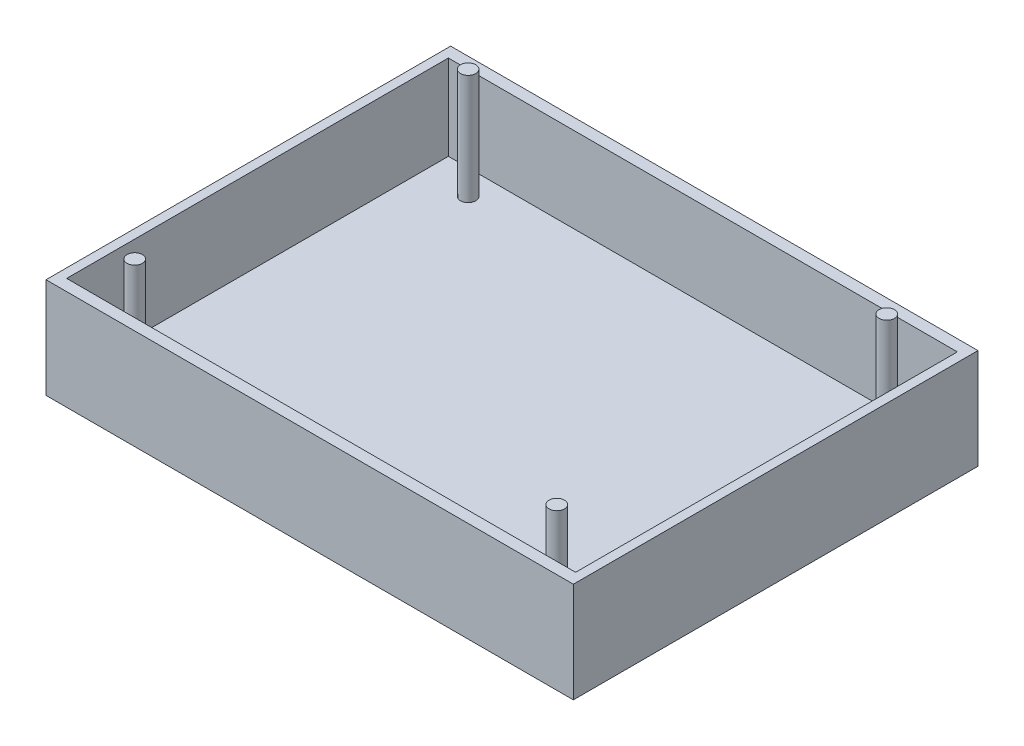
ISO-10303-21;
HEADER;
FILE_DESCRIPTION(('STEP AP214'),'2;1');
FILE_NAME('part.step','',(''),(''),'','','');
FILE_SCHEMA(('AUTOMOTIVE_DESIGN { 1 0 10303 214 1 1 1 1 }'));
ENDSEC;
DATA;
#1=APPLICATION_CONTEXT('core data for automotive mechanical design processes');
#2=APPLICATION_PROTOCOL_DEFINITION('international standard','automotive_design',2000,#1);
#3=PRODUCT_CONTEXT('',#1,'mechanical');
#4=PRODUCT('Part','Part','',(#3));
#5=PRODUCT_RELATED_PRODUCT_CATEGORY('part','',(#4));
#6=PRODUCT_DEFINITION_FORMATION('','',#4);
#7=PRODUCT_DEFINITION_CONTEXT('part definition',#1,'design');
#8=PRODUCT_DEFINITION('design','',#6,#7);
#9=PRODUCT_DEFINITION_SHAPE('','',#8);
#10=(LENGTH_UNIT() NAMED_UNIT(*) SI_UNIT(.MILLI.,.METRE.));
#11=(NAMED_UNIT(*) PLANE_ANGLE_UNIT() SI_UNIT($,.RADIAN.));
#12=(NAMED_UNIT(*) SI_UNIT($,.STERADIAN.) SOLID_ANGLE_UNIT());
#13=UNCERTAINTY_MEASURE_WITH_UNIT(LENGTH_MEASURE(1.E-05),#10,'distance_accuracy_value','');
#14=(GEOMETRIC_REPRESENTATION_CONTEXT(3) GLOBAL_UNCERTAINTY_ASSIGNED_CONTEXT((#13)) GLOBAL_UNIT_ASSIGNED_CONTEXT((#10,
#11,#12)) REPRESENTATION_CONTEXT('',''));
#15=CARTESIAN_POINT('',(0.,0.,0.));
#16=DIRECTION('',(0.,0.,1.));
#17=DIRECTION('',(1.,0.,0.));
#18=AXIS2_PLACEMENT_3D('',#15,#16,#17);
#19=CARTESIAN_POINT('',(0.,3.,0.));
#20=DIRECTION('',(0.,1.,0.));
#21=DIRECTION('',(0.,0.,1.));
#22=AXIS2_PLACEMENT_3D('',#19,#20,#21);
#23=PLANE('',#22);
#24=CARTESIAN_POINT('',(-42.3706026608546,3.,32.9365231621487));
#25=DIRECTION('',(0.,1.,0.));
#26=DIRECTION('',(0.,0.,1.));
#27=AXIS2_PLACEMENT_3D('',#24,#25,#26);
#28=CIRCLE('',#27,1.524);
#29=CARTESIAN_POINT('',(-42.3706026608546,3.,34.4605231621486));
#30=VERTEX_POINT('',#29);
#31=EDGE_CURVE('E202',#30,#30,#28,.T.);
#32=ORIENTED_EDGE('',*,*,#31,.F.);
#33=EDGE_LOOP('',(#32));
#34=FACE_BOUND('',#33,.T.);
#35=CARTESIAN_POINT('',(42.2050924942106,3.,33.2675434954366));
#36=DIRECTION('',(0.,1.,0.));
#37=DIRECTION('',(0.,0.,1.));
#38=AXIS2_PLACEMENT_3D('',#35,#36,#37);
#39=CIRCLE('',#38,1.524);
#40=CARTESIAN_POINT('',(42.2050924942106,3.,34.7915434954366));
#41=VERTEX_POINT('',#40);
#42=EDGE_CURVE('E206',#41,#41,#39,.T.);
#43=ORIENTED_EDGE('',*,*,#42,.F.);
#44=EDGE_LOOP('',(#43));
#45=FACE_BOUND('',#44,.T.);
#46=CARTESIAN_POINT('',(42.2050924942106,3.,-32.6055028288607));
#47=DIRECTION('',(0.,1.,0.));
#48=DIRECTION('',(0.,0.,1.));
#49=AXIS2_PLACEMENT_3D('',#46,#47,#48);
#50=CIRCLE('',#49,1.524);
#51=CARTESIAN_POINT('',(42.2050924942106,3.,-31.0815028288607));
#52=VERTEX_POINT('',#51);
#53=EDGE_CURVE('E210',#52,#52,#50,.T.);
#54=ORIENTED_EDGE('',*,*,#53,.F.);
#55=EDGE_LOOP('',(#54));
#56=FACE_BOUND('',#55,.T.);
#57=CARTESIAN_POINT('',(-41.91,3.,-33.147));
#58=DIRECTION('',(0.,1.,0.));
#59=DIRECTION('',(0.,0.,1.));
#60=AXIS2_PLACEMENT_3D('',#57,#58,#59);
#61=CIRCLE('',#60,1.524);
#62=CARTESIAN_POINT('',(-41.91,3.,-31.623));
#63=VERTEX_POINT('',#62);
#64=EDGE_CURVE('E214',#63,#63,#61,.T.);
#65=ORIENTED_EDGE('',*,*,#64,.F.);
#66=EDGE_LOOP('',(#65));
#67=FACE_BOUND('',#66,.T.);
#68=DIRECTION('',(1.,0.,0.));
#69=VECTOR('',#68,1.);
#70=CARTESIAN_POINT('',(0.,3.,38.1));
#71=LINE('',#70,#69);
#72=CARTESIAN_POINT('',(-50.8,3.,38.1));
#73=VERTEX_POINT('',#72);
#74=CARTESIAN_POINT('',(50.8,3.,38.1));
#75=VERTEX_POINT('',#74);
#76=EDGE_CURVE('E218',#73,#75,#71,.T.);
#77=ORIENTED_EDGE('',*,*,#76,.T.);
#78=DIRECTION('',(0.,0.,-1.));
#79=VECTOR('',#78,1.);
#80=CARTESIAN_POINT('',(50.8,3.,0.));
#81=LINE('',#80,#79);
#82=CARTESIAN_POINT('',(50.8,3.,-38.1));
#83=VERTEX_POINT('',#82);
#84=EDGE_CURVE('E106',#75,#83,#81,.T.);
#85=ORIENTED_EDGE('',*,*,#84,.T.);
#86=DIRECTION('',(1.,0.,0.));
#87=VECTOR('',#86,1.);
#88=CARTESIAN_POINT('',(0.,3.,-38.1));
#89=LINE('',#88,#87);
#90=CARTESIAN_POINT('',(-50.8,3.,-38.1));
#91=VERTEX_POINT('',#90);
#92=EDGE_CURVE('E48',#91,#83,#89,.T.);
#93=ORIENTED_EDGE('',*,*,#92,.F.);
#94=DIRECTION('',(0.,0.,-1.));
#95=VECTOR('',#94,1.);
#96=CARTESIAN_POINT('',(-50.8,3.,0.));
#97=LINE('',#96,#95);
#98=EDGE_CURVE('E11',#73,#91,#97,.T.);
#99=ORIENTED_EDGE('',*,*,#98,.F.);
#100=EDGE_LOOP('',(#77,#85,#93,#99));
#101=FACE_BOUND('',#100,.T.);
#102=ADVANCED_FACE('F39',(#34,#45,#56,#67,#101),#23,.T.);
#103=CARTESIAN_POINT('',(-42.3706026608546,25.,32.9365231621487));
#104=DIRECTION('',(0.,-1.,0.));
#105=DIRECTION('',(0.,0.,-1.));
#106=AXIS2_PLACEMENT_3D('',#103,#104,#105);
#107=CYLINDRICAL_SURFACE('',#106,1.524);
#108=ORIENTED_EDGE('',*,*,#31,.T.);
#109=EDGE_LOOP('',(#108));
#110=FACE_BOUND('',#109,.T.);
#111=CARTESIAN_POINT('',(-42.3706026608546,25.,32.9365231621487));
#112=DIRECTION('',(0.,1.,0.));
#113=DIRECTION('',(0.,0.,1.));
#114=AXIS2_PLACEMENT_3D('',#111,#112,#113);
#115=CIRCLE('',#114,1.524);
#116=CARTESIAN_POINT('',(-42.3706026608546,25.,34.4605231621486));
#117=VERTEX_POINT('',#116);
#118=EDGE_CURVE('E198',#117,#117,#115,.T.);
#119=ORIENTED_EDGE('',*,*,#118,.F.);
#120=EDGE_LOOP('',(#119));
#121=FACE_BOUND('',#120,.T.);
#122=ADVANCED_FACE('F238',(#110,#121),#107,.T.);
#123=CARTESIAN_POINT('',(-42.3706026608546,25.,32.9365231621487));
#124=DIRECTION('',(0.,1.,0.));
#125=DIRECTION('',(0.,0.,1.));
#126=AXIS2_PLACEMENT_3D('',#123,#124,#125);
#127=PLANE('',#126);
#128=ORIENTED_EDGE('',*,*,#118,.T.);
#129=EDGE_LOOP('',(#128));
#130=FACE_BOUND('',#129,.T.);
#131=ADVANCED_FACE('F243',(#130),#127,.T.);
#132=CARTESIAN_POINT('',(-41.91,25.,-33.147));
#133=DIRECTION('',(0.,-1.,0.));
#134=DIRECTION('',(0.,0.,-1.));
#135=AXIS2_PLACEMENT_3D('',#132,#133,#134);
#136=CYLINDRICAL_SURFACE('',#135,1.524);
#137=ORIENTED_EDGE('',*,*,#64,.T.);
#138=EDGE_LOOP('',(#137));
#139=FACE_BOUND('',#138,.T.);
#140=CARTESIAN_POINT('',(-41.91,25.,-33.147));
#141=DIRECTION('',(0.,1.,0.));
#142=DIRECTION('',(0.,0.,1.));
#143=AXIS2_PLACEMENT_3D('',#140,#141,#142);
#144=CIRCLE('',#143,1.524);
#145=CARTESIAN_POINT('',(-41.91,25.,-31.623));
#146=VERTEX_POINT('',#145);
#147=EDGE_CURVE('E194',#146,#146,#144,.T.);
#148=ORIENTED_EDGE('',*,*,#147,.F.);
#149=EDGE_LOOP('',(#148));
#150=FACE_BOUND('',#149,.T.);
#151=ADVANCED_FACE('F251',(#139,#150),#136,.T.);
#152=CARTESIAN_POINT('',(-41.91,25.,-33.147));
#153=DIRECTION('',(0.,1.,0.));
#154=DIRECTION('',(0.,0.,1.));
#155=AXIS2_PLACEMENT_3D('',#152,#153,#154);
#156=PLANE('',#155);
#157=ORIENTED_EDGE('',*,*,#147,.T.);
#158=EDGE_LOOP('',(#157));
#159=FACE_BOUND('',#158,.T.);
#160=ADVANCED_FACE('F253',(#159),#156,.T.);
#161=CARTESIAN_POINT('',(42.2050924942106,25.,-32.6055028288607));
#162=DIRECTION('',(0.,-1.,0.));
#163=DIRECTION('',(0.,0.,-1.));
#164=AXIS2_PLACEMENT_3D('',#161,#162,#163);
#165=CYLINDRICAL_SURFACE('',#164,1.524);
#166=ORIENTED_EDGE('',*,*,#53,.T.);
#167=EDGE_LOOP('',(#166));
#168=FACE_BOUND('',#167,.T.);
#169=CARTESIAN_POINT('',(42.2050924942106,25.,-32.6055028288607));
#170=DIRECTION('',(0.,1.,0.));
#171=DIRECTION('',(0.,0.,1.));
#172=AXIS2_PLACEMENT_3D('',#169,#170,#171);
#173=CIRCLE('',#172,1.524);
#174=CARTESIAN_POINT('',(42.2050924942106,25.,-31.0815028288607));
#175=VERTEX_POINT('',#174);
#176=EDGE_CURVE('E190',#175,#175,#173,.T.);
#177=ORIENTED_EDGE('',*,*,#176,.F.);
#178=EDGE_LOOP('',(#177));
#179=FACE_BOUND('',#178,.T.);
#180=ADVANCED_FACE('F256',(#168,#179),#165,.T.);
#181=CARTESIAN_POINT('',(42.2050924942106,25.,-32.6055028288607));
#182=DIRECTION('',(0.,1.,0.));
#183=DIRECTION('',(0.,0.,1.));
#184=AXIS2_PLACEMENT_3D('',#181,#182,#183);
#185=PLANE('',#184);
#186=ORIENTED_EDGE('',*,*,#176,.T.);
#187=EDGE_LOOP('',(#186));
#188=FACE_BOUND('',#187,.T.);
#189=ADVANCED_FACE('F261',(#188),#185,.T.);
#190=CARTESIAN_POINT('',(42.2050924942106,25.,33.2675434954366));
#191=DIRECTION('',(0.,-1.,0.));
#192=DIRECTION('',(0.,0.,-1.));
#193=AXIS2_PLACEMENT_3D('',#190,#191,#192);
#194=CYLINDRICAL_SURFACE('',#193,1.524);
#195=ORIENTED_EDGE('',*,*,#42,.T.);
#196=EDGE_LOOP('',(#195));
#197=FACE_BOUND('',#196,.T.);
#198=CARTESIAN_POINT('',(42.2050924942106,25.,33.2675434954366));
#199=DIRECTION('',(0.,1.,0.));
#200=DIRECTION('',(0.,0.,1.));
#201=AXIS2_PLACEMENT_3D('',#198,#199,#200);
#202=CIRCLE('',#201,1.524);
#203=CARTESIAN_POINT('',(42.2050924942106,25.,34.7915434954366));
#204=VERTEX_POINT('',#203);
#205=EDGE_CURVE('E178',#204,#204,#202,.T.);
#206=ORIENTED_EDGE('',*,*,#205,.F.);
#207=EDGE_LOOP('',(#206));
#208=FACE_BOUND('',#207,.T.);
#209=ADVANCED_FACE('F264',(#197,#208),#194,.T.);
#210=CARTESIAN_POINT('',(42.2050924942106,25.,33.2675434954366));
#211=DIRECTION('',(0.,1.,0.));
#212=DIRECTION('',(0.,0.,1.));
#213=AXIS2_PLACEMENT_3D('',#210,#211,#212);
#214=PLANE('',#213);
#215=ORIENTED_EDGE('',*,*,#205,.T.);
#216=EDGE_LOOP('',(#215));
#217=FACE_BOUND('',#216,.T.);
#218=ADVANCED_FACE('F269',(#217),#214,.T.);
#219=CARTESIAN_POINT('',(0.,20.,40.384480661127));
#220=DIRECTION('',(0.,0.,-1.));
#221=DIRECTION('',(-1.,0.,0.));
#222=AXIS2_PLACEMENT_3D('',#219,#220,#221);
#223=PLANE('',#222);
#224=DIRECTION('',(1.,0.,0.));
#225=VECTOR('',#224,1.);
#226=CARTESIAN_POINT('',(0.,0.,40.384480661127));
#227=LINE('',#226,#225);
#228=CARTESIAN_POINT('',(-52.6322329927802,0.,40.384480661127));
#229=VERTEX_POINT('',#228);
#230=CARTESIAN_POINT('',(52.6322329927802,0.,40.384480661127));
#231=VERTEX_POINT('',#230);
#232=EDGE_CURVE('E151',#229,#231,#227,.T.);
#233=ORIENTED_EDGE('',*,*,#232,.T.);
#234=DIRECTION('',(0.,-1.,0.));
#235=VECTOR('',#234,1.);
#236=CARTESIAN_POINT('',(52.6322329927802,20.,40.384480661127));
#237=LINE('',#236,#235);
#238=CARTESIAN_POINT('',(52.6322329927802,20.,40.384480661127));
#239=VERTEX_POINT('',#238);
#240=EDGE_CURVE('E174',#239,#231,#237,.T.);
#241=ORIENTED_EDGE('',*,*,#240,.F.);
#242=DIRECTION('',(1.,0.,0.));
#243=VECTOR('',#242,1.);
#244=CARTESIAN_POINT('',(0.,20.,40.384480661127));
#245=LINE('',#244,#243);
#246=CARTESIAN_POINT('',(-52.6322329927802,20.,40.384480661127));
#247=VERTEX_POINT('',#246);
#248=EDGE_CURVE('E135',#247,#239,#245,.T.);
#249=ORIENTED_EDGE('',*,*,#248,.F.);
#250=DIRECTION('',(0.,-1.,0.));
#251=VECTOR('',#250,1.);
#252=CARTESIAN_POINT('',(-52.6322329927802,20.,40.384480661127));
#253=LINE('',#252,#251);
#254=EDGE_CURVE('E110',#247,#229,#253,.T.);
#255=ORIENTED_EDGE('',*,*,#254,.T.);
#256=EDGE_LOOP('',(#233,#241,#249,#255));
#257=FACE_BOUND('',#256,.T.);
#258=ADVANCED_FACE('F272',(#257),#223,.F.);
#259=CARTESIAN_POINT('',(52.6322329927802,20.,0.));
#260=DIRECTION('',(-1.,0.,0.));
#261=DIRECTION('',(0.,0.,1.));
#262=AXIS2_PLACEMENT_3D('',#259,#260,#261);
#263=PLANE('',#262);
#264=DIRECTION('',(0.,0.,-1.));
#265=VECTOR('',#264,1.);
#266=CARTESIAN_POINT('',(52.6322329927802,0.,0.));
#267=LINE('',#266,#265);
#268=CARTESIAN_POINT('',(52.6322329927802,0.,-40.384480661127));
#269=VERTEX_POINT('',#268);
#270=EDGE_CURVE('E155',#231,#269,#267,.T.);
#271=ORIENTED_EDGE('',*,*,#270,.T.);
#272=DIRECTION('',(0.,-1.,0.));
#273=VECTOR('',#272,1.);
#274=CARTESIAN_POINT('',(52.6322329927802,20.,-40.384480661127));
#275=LINE('',#274,#273);
#276=CARTESIAN_POINT('',(52.6322329927802,20.,-40.384480661127));
#277=VERTEX_POINT('',#276);
#278=EDGE_CURVE('E171',#277,#269,#275,.T.);
#279=ORIENTED_EDGE('',*,*,#278,.F.);
#280=DIRECTION('',(0.,0.,-1.));
#281=VECTOR('',#280,1.);
#282=CARTESIAN_POINT('',(52.6322329927802,20.,0.));
#283=LINE('',#282,#281);
#284=EDGE_CURVE('E139',#239,#277,#283,.T.);
#285=ORIENTED_EDGE('',*,*,#284,.F.);
#286=ORIENTED_EDGE('',*,*,#240,.T.);
#287=EDGE_LOOP('',(#271,#279,#285,#286));
#288=FACE_BOUND('',#287,.T.);
#289=ADVANCED_FACE('F282',(#288),#263,.F.);
#290=CARTESIAN_POINT('',(0.,20.,-40.384480661127));
#291=DIRECTION('',(0.,0.,-1.));
#292=DIRECTION('',(-1.,0.,0.));
#293=AXIS2_PLACEMENT_3D('',#290,#291,#292);
#294=PLANE('',#293);
#295=DIRECTION('',(1.,0.,0.));
#296=VECTOR('',#295,1.);
#297=CARTESIAN_POINT('',(0.,0.,-40.384480661127));
#298=LINE('',#297,#296);
#299=CARTESIAN_POINT('',(-52.6322329927802,0.,-40.384480661127));
#300=VERTEX_POINT('',#299);
#301=EDGE_CURVE('E159',#300,#269,#298,.T.);
#302=ORIENTED_EDGE('',*,*,#301,.F.);
#303=DIRECTION('',(0.,-1.,0.));
#304=VECTOR('',#303,1.);
#305=CARTESIAN_POINT('',(-52.6322329927802,20.,-40.384480661127));
#306=LINE('',#305,#304);
#307=CARTESIAN_POINT('',(-52.6322329927802,20.,-40.384480661127));
#308=VERTEX_POINT('',#307);
#309=EDGE_CURVE('E168',#308,#300,#306,.T.);
#310=ORIENTED_EDGE('',*,*,#309,.F.);
#311=DIRECTION('',(1.,0.,0.));
#312=VECTOR('',#311,1.);
#313=CARTESIAN_POINT('',(0.,20.,-40.384480661127));
#314=LINE('',#313,#312);
#315=EDGE_CURVE('E142',#308,#277,#314,.T.);
#316=ORIENTED_EDGE('',*,*,#315,.T.);
#317=ORIENTED_EDGE('',*,*,#278,.T.);
#318=EDGE_LOOP('',(#302,#310,#316,#317));
#319=FACE_BOUND('',#318,.T.);
#320=ADVANCED_FACE('F278',(#319),#294,.T.);
#321=CARTESIAN_POINT('',(50.8,20.,0.));
#322=DIRECTION('',(-1.,0.,0.));
#323=DIRECTION('',(0.,0.,1.));
#324=AXIS2_PLACEMENT_3D('',#321,#322,#323);
#325=PLANE('',#324);
#326=DIRECTION('',(0.,-1.,0.));
#327=VECTOR('',#326,1.);
#328=CARTESIAN_POINT('',(50.8,20.,-38.1));
#329=LINE('',#328,#327);
#330=CARTESIAN_POINT('',(50.8,20.,-38.1));
#331=VERTEX_POINT('',#330);
#332=EDGE_CURVE('E150',#331,#83,#329,.T.);
#333=ORIENTED_EDGE('',*,*,#332,.T.);
#334=ORIENTED_EDGE('',*,*,#84,.F.);
#335=DIRECTION('',(0.,-1.,0.));
#336=VECTOR('',#335,1.);
#337=CARTESIAN_POINT('',(50.8,20.,38.1));
#338=LINE('',#337,#336);
#339=CARTESIAN_POINT('',(50.8,20.,38.1));
#340=VERTEX_POINT('',#339);
#341=EDGE_CURVE('E101',#340,#75,#338,.T.);
#342=ORIENTED_EDGE('',*,*,#341,.F.);
#343=DIRECTION('',(0.,0.,-1.));
#344=VECTOR('',#343,1.);
#345=CARTESIAN_POINT('',(50.8,20.,0.));
#346=LINE('',#345,#344);
#347=EDGE_CURVE('E105',#340,#331,#346,.T.);
#348=ORIENTED_EDGE('',*,*,#347,.T.);
#349=EDGE_LOOP('',(#333,#334,#342,#348));
#350=FACE_BOUND('',#349,.T.);
#351=ADVANCED_FACE('F104',(#350),#325,.T.);
#352=CARTESIAN_POINT('',(0.,20.,38.1));
#353=DIRECTION('',(0.,0.,-1.));
#354=DIRECTION('',(-1.,0.,0.));
#355=AXIS2_PLACEMENT_3D('',#352,#353,#354);
#356=PLANE('',#355);
#357=ORIENTED_EDGE('',*,*,#341,.T.);
#358=ORIENTED_EDGE('',*,*,#76,.F.);
#359=DIRECTION('',(0.,-1.,0.));
#360=VECTOR('',#359,1.);
#361=CARTESIAN_POINT('',(-50.8,20.,38.1));
#362=LINE('',#361,#360);
#363=CARTESIAN_POINT('',(-50.8,20.,38.1));
#364=VERTEX_POINT('',#363);
#365=EDGE_CURVE('E111',#364,#73,#362,.T.);
#366=ORIENTED_EDGE('',*,*,#365,.F.);
#367=DIRECTION('',(1.,0.,0.));
#368=VECTOR('',#367,1.);
#369=CARTESIAN_POINT('',(0.,20.,38.1));
#370=LINE('',#369,#368);
#371=EDGE_CURVE('E117',#364,#340,#370,.T.);
#372=ORIENTED_EDGE('',*,*,#371,.T.);
#373=EDGE_LOOP('',(#357,#358,#366,#372));
#374=FACE_BOUND('',#373,.T.);
#375=ADVANCED_FACE('F124',(#374),#356,.T.);
#376=CARTESIAN_POINT('',(-50.8,20.,0.));
#377=DIRECTION('',(-1.,0.,0.));
#378=DIRECTION('',(0.,0.,1.));
#379=AXIS2_PLACEMENT_3D('',#376,#377,#378);
#380=PLANE('',#379);
#381=ORIENTED_EDGE('',*,*,#98,.T.);
#382=DIRECTION('',(0.,-1.,0.));
#383=VECTOR('',#382,1.);
#384=CARTESIAN_POINT('',(-50.8,20.,-38.1));
#385=LINE('',#384,#383);
#386=CARTESIAN_POINT('',(-50.8,20.,-38.1));
#387=VERTEX_POINT('',#386);
#388=EDGE_CURVE('E181',#387,#91,#385,.T.);
#389=ORIENTED_EDGE('',*,*,#388,.F.);
#390=DIRECTION('',(0.,0.,-1.));
#391=VECTOR('',#390,1.);
#392=CARTESIAN_POINT('',(-50.8,20.,0.));
#393=LINE('',#392,#391);
#394=EDGE_CURVE('E128',#364,#387,#393,.T.);
#395=ORIENTED_EDGE('',*,*,#394,.F.);
#396=ORIENTED_EDGE('',*,*,#365,.T.);
#397=EDGE_LOOP('',(#381,#389,#395,#396));
#398=FACE_BOUND('',#397,.T.);
#399=ADVANCED_FACE('F227',(#398),#380,.F.);
#400=CARTESIAN_POINT('',(0.,20.,-38.1));
#401=DIRECTION('',(0.,0.,-1.));
#402=DIRECTION('',(-1.,0.,0.));
#403=AXIS2_PLACEMENT_3D('',#400,#401,#402);
#404=PLANE('',#403);
#405=ORIENTED_EDGE('',*,*,#92,.T.);
#406=ORIENTED_EDGE('',*,*,#332,.F.);
#407=DIRECTION('',(1.,0.,0.));
#408=VECTOR('',#407,1.);
#409=CARTESIAN_POINT('',(0.,20.,-38.1));
#410=LINE('',#409,#408);
#411=EDGE_CURVE('E119',#387,#331,#410,.T.);
#412=ORIENTED_EDGE('',*,*,#411,.F.);
#413=ORIENTED_EDGE('',*,*,#388,.T.);
#414=EDGE_LOOP('',(#405,#406,#412,#413));
#415=FACE_BOUND('',#414,.T.);
#416=ADVANCED_FACE('F224',(#415),#404,.F.);
#417=CARTESIAN_POINT('',(-52.6322329927802,20.,0.));
#418=DIRECTION('',(-1.,0.,0.));
#419=DIRECTION('',(0.,0.,1.));
#420=AXIS2_PLACEMENT_3D('',#417,#418,#419);
#421=PLANE('',#420);
#422=DIRECTION('',(0.,0.,-1.));
#423=VECTOR('',#422,1.);
#424=CARTESIAN_POINT('',(-52.6322329927802,0.,0.));
#425=LINE('',#424,#423);
#426=EDGE_CURVE('E122',#229,#300,#425,.T.);
#427=ORIENTED_EDGE('',*,*,#426,.F.);
#428=ORIENTED_EDGE('',*,*,#254,.F.);
#429=DIRECTION('',(0.,0.,-1.));
#430=VECTOR('',#429,1.);
#431=CARTESIAN_POINT('',(-52.6322329927802,20.,0.));
#432=LINE('',#431,#430);
#433=EDGE_CURVE('E146',#247,#308,#432,.T.);
#434=ORIENTED_EDGE('',*,*,#433,.T.);
#435=ORIENTED_EDGE('',*,*,#309,.T.);
#436=EDGE_LOOP('',(#427,#428,#434,#435));
#437=FACE_BOUND('',#436,.T.);
#438=ADVANCED_FACE('F234',(#437),#421,.T.);
#439=CARTESIAN_POINT('',(0.,20.,0.));
#440=DIRECTION('',(0.,1.,0.));
#441=DIRECTION('',(0.,0.,1.));
#442=AXIS2_PLACEMENT_3D('',#439,#440,#441);
#443=PLANE('',#442);
#444=ORIENTED_EDGE('',*,*,#347,.F.);
#445=ORIENTED_EDGE('',*,*,#371,.F.);
#446=ORIENTED_EDGE('',*,*,#394,.T.);
#447=ORIENTED_EDGE('',*,*,#411,.T.);
#448=EDGE_LOOP('',(#444,#445,#446,#447));
#449=FACE_BOUND('',#448,.T.);
#450=ORIENTED_EDGE('',*,*,#248,.T.);
#451=ORIENTED_EDGE('',*,*,#284,.T.);
#452=ORIENTED_EDGE('',*,*,#315,.F.);
#453=ORIENTED_EDGE('',*,*,#433,.F.);
#454=EDGE_LOOP('',(#450,#451,#452,#453));
#455=FACE_BOUND('',#454,.T.);
#456=ADVANCED_FACE('F115',(#449,#455),#443,.T.);
#457=CARTESIAN_POINT('',(0.,0.,0.));
#458=DIRECTION('',(0.,1.,0.));
#459=DIRECTION('',(0.,0.,1.));
#460=AXIS2_PLACEMENT_3D('',#457,#458,#459);
#461=PLANE('',#460);
#462=ORIENTED_EDGE('',*,*,#232,.F.);
#463=ORIENTED_EDGE('',*,*,#426,.T.);
#464=ORIENTED_EDGE('',*,*,#301,.T.);
#465=ORIENTED_EDGE('',*,*,#270,.F.);
#466=EDGE_LOOP('',(#462,#463,#464,#465));
#467=FACE_BOUND('',#466,.T.);
#468=ADVANCED_FACE('F41',(#467),#461,.F.);
#469=CLOSED_SHELL('',(#102,#122,#131,#151,#160,#180,#189,#209,#218,#258,#289,#320,#351,#375,
#399,#416,#438,#456,#468));
#470=MANIFOLD_SOLID_BREP('B2',#469);
#471=ADVANCED_BREP_SHAPE_REPRESENTATION('',(#18,#470),#14);
#472=SHAPE_DEFINITION_REPRESENTATION(#9,#471);
ENDSEC;
END-ISO-10303-21;
